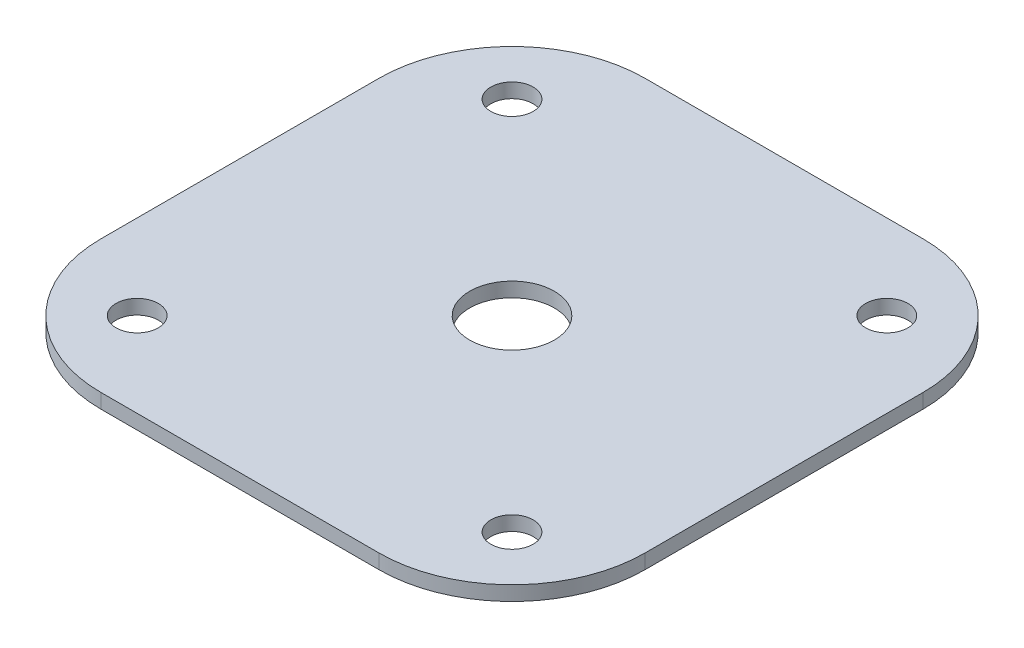
ISO-10303-21;
HEADER;
FILE_DESCRIPTION(('STEP AP214'),'2;1');
FILE_NAME('part.step','',(''),(''),'','','');
FILE_SCHEMA(('AUTOMOTIVE_DESIGN { 1 0 10303 214 1 1 1 1 }'));
ENDSEC;
DATA;
#1=APPLICATION_CONTEXT('core data for automotive mechanical design processes');
#2=APPLICATION_PROTOCOL_DEFINITION('international standard','automotive_design',2000,#1);
#3=PRODUCT_CONTEXT('',#1,'mechanical');
#4=PRODUCT('Part','Part','',(#3));
#5=PRODUCT_RELATED_PRODUCT_CATEGORY('part','',(#4));
#6=PRODUCT_DEFINITION_FORMATION('','',#4);
#7=PRODUCT_DEFINITION_CONTEXT('part definition',#1,'design');
#8=PRODUCT_DEFINITION('design','',#6,#7);
#9=PRODUCT_DEFINITION_SHAPE('','',#8);
#10=(LENGTH_UNIT() NAMED_UNIT(*) SI_UNIT(.MILLI.,.METRE.));
#11=(NAMED_UNIT(*) PLANE_ANGLE_UNIT() SI_UNIT($,.RADIAN.));
#12=(NAMED_UNIT(*) SI_UNIT($,.STERADIAN.) SOLID_ANGLE_UNIT());
#13=UNCERTAINTY_MEASURE_WITH_UNIT(LENGTH_MEASURE(1.E-05),#10,'distance_accuracy_value','');
#14=(GEOMETRIC_REPRESENTATION_CONTEXT(3) GLOBAL_UNCERTAINTY_ASSIGNED_CONTEXT((#13)) GLOBAL_UNIT_ASSIGNED_CONTEXT((#10,
#11,#12)) REPRESENTATION_CONTEXT('',''));
#15=CARTESIAN_POINT('',(0.,0.,0.));
#16=DIRECTION('',(0.,0.,1.));
#17=DIRECTION('',(1.,0.,0.));
#18=AXIS2_PLACEMENT_3D('',#15,#16,#17);
#19=CARTESIAN_POINT('',(-11.5,1.2,11.5));
#20=DIRECTION('',(0.,1.,0.));
#21=DIRECTION('',(0.,0.,1.));
#22=AXIS2_PLACEMENT_3D('',#19,#20,#21);
#23=PLANE('',#22);
#24=CARTESIAN_POINT('',(15.5,1.2,15.5));
#25=DIRECTION('',(0.,1.,0.));
#26=DIRECTION('',(0.,0.,-1.));
#27=AXIS2_PLACEMENT_3D('',#24,#25,#26);
#28=CIRCLE('',#27,1.75);
#29=CARTESIAN_POINT('',(15.5,1.2,13.75));
#30=VERTEX_POINT('',#29);
#31=EDGE_CURVE('E193',#30,#30,#28,.T.);
#32=ORIENTED_EDGE('',*,*,#31,.F.);
#33=EDGE_LOOP('',(#32));
#34=FACE_BOUND('',#33,.T.);
#35=CARTESIAN_POINT('',(-15.5,1.2,-15.5));
#36=DIRECTION('',(0.,1.,0.));
#37=DIRECTION('',(0.,0.,1.));
#38=AXIS2_PLACEMENT_3D('',#35,#36,#37);
#39=CIRCLE('',#38,1.75);
#40=CARTESIAN_POINT('',(-15.5,1.2,-13.75));
#41=VERTEX_POINT('',#40);
#42=EDGE_CURVE('E181',#41,#41,#39,.T.);
#43=ORIENTED_EDGE('',*,*,#42,.F.);
#44=EDGE_LOOP('',(#43));
#45=FACE_BOUND('',#44,.T.);
#46=CARTESIAN_POINT('',(-11.5,1.2,11.5));
#47=DIRECTION('',(0.,1.,0.));
#48=DIRECTION('',(0.,0.,1.));
#49=AXIS2_PLACEMENT_3D('',#46,#47,#48);
#50=CIRCLE('',#49,11.);
#51=CARTESIAN_POINT('',(-22.5,1.2,11.5));
#52=VERTEX_POINT('',#51);
#53=CARTESIAN_POINT('',(-11.5,1.2,22.5));
#54=VERTEX_POINT('',#53);
#55=EDGE_CURVE('E144',#52,#54,#50,.T.);
#56=ORIENTED_EDGE('',*,*,#55,.T.);
#57=DIRECTION('',(1.,0.,0.));
#58=VECTOR('',#57,1.);
#59=CARTESIAN_POINT('',(-11.5,1.2,22.5));
#60=LINE('',#59,#58);
#61=CARTESIAN_POINT('',(11.5,1.2,22.5));
#62=VERTEX_POINT('',#61);
#63=EDGE_CURVE('E92',#54,#62,#60,.T.);
#64=ORIENTED_EDGE('',*,*,#63,.T.);
#65=CARTESIAN_POINT('',(11.5,1.2,11.5));
#66=DIRECTION('',(0.,1.,0.));
#67=DIRECTION('',(0.,0.,1.));
#68=AXIS2_PLACEMENT_3D('',#65,#66,#67);
#69=CIRCLE('',#68,11.);
#70=CARTESIAN_POINT('',(22.5,1.2,11.5));
#71=VERTEX_POINT('',#70);
#72=EDGE_CURVE('E159',#62,#71,#69,.T.);
#73=ORIENTED_EDGE('',*,*,#72,.T.);
#74=DIRECTION('',(0.,0.,-1.));
#75=VECTOR('',#74,1.);
#76=CARTESIAN_POINT('',(22.5,1.2,-11.5));
#77=LINE('',#76,#75);
#78=CARTESIAN_POINT('',(22.5,1.2,-11.5));
#79=VERTEX_POINT('',#78);
#80=EDGE_CURVE('E172',#71,#79,#77,.T.);
#81=ORIENTED_EDGE('',*,*,#80,.T.);
#82=CARTESIAN_POINT('',(11.5,1.2,-11.5));
#83=DIRECTION('',(0.,1.,0.));
#84=DIRECTION('',(0.,0.,-1.));
#85=AXIS2_PLACEMENT_3D('',#82,#83,#84);
#86=CIRCLE('',#85,11.);
#87=CARTESIAN_POINT('',(11.5,1.2,-22.5));
#88=VERTEX_POINT('',#87);
#89=EDGE_CURVE('E111',#79,#88,#86,.T.);
#90=ORIENTED_EDGE('',*,*,#89,.T.);
#91=DIRECTION('',(-1.,0.,0.));
#92=VECTOR('',#91,1.);
#93=CARTESIAN_POINT('',(-11.5,1.2,-22.5));
#94=LINE('',#93,#92);
#95=CARTESIAN_POINT('',(-11.5,1.2,-22.5));
#96=VERTEX_POINT('',#95);
#97=EDGE_CURVE('E105',#88,#96,#94,.T.);
#98=ORIENTED_EDGE('',*,*,#97,.T.);
#99=CARTESIAN_POINT('',(-11.5,1.2,-11.5));
#100=DIRECTION('',(0.,1.,0.));
#101=DIRECTION('',(0.,0.,1.));
#102=AXIS2_PLACEMENT_3D('',#99,#100,#101);
#103=CIRCLE('',#102,11.);
#104=CARTESIAN_POINT('',(-22.5,1.2,-11.5));
#105=VERTEX_POINT('',#104);
#106=EDGE_CURVE('E109',#96,#105,#103,.T.);
#107=ORIENTED_EDGE('',*,*,#106,.T.);
#108=DIRECTION('',(0.,0.,1.));
#109=VECTOR('',#108,1.);
#110=CARTESIAN_POINT('',(-22.5,1.2,-11.5));
#111=LINE('',#110,#109);
#112=EDGE_CURVE('E49',#105,#52,#111,.T.);
#113=ORIENTED_EDGE('',*,*,#112,.T.);
#114=EDGE_LOOP('',(#56,#64,#73,#81,#90,#98,#107,#113));
#115=FACE_BOUND('',#114,.T.);
#116=CARTESIAN_POINT('',(0.,1.2,0.));
#117=DIRECTION('',(0.,1.,0.));
#118=DIRECTION('',(0.,0.,1.));
#119=AXIS2_PLACEMENT_3D('',#116,#117,#118);
#120=CIRCLE('',#119,3.5);
#121=CARTESIAN_POINT('',(0.,1.2,3.5));
#122=VERTEX_POINT('',#121);
#123=EDGE_CURVE('E133',#122,#122,#120,.T.);
#124=ORIENTED_EDGE('',*,*,#123,.F.);
#125=EDGE_LOOP('',(#124));
#126=FACE_BOUND('',#125,.T.);
#127=CARTESIAN_POINT('',(15.5,1.2,-15.5));
#128=DIRECTION('',(0.,1.,0.));
#129=DIRECTION('',(0.,0.,1.));
#130=AXIS2_PLACEMENT_3D('',#127,#128,#129);
#131=CIRCLE('',#130,1.75);
#132=CARTESIAN_POINT('',(15.5,1.2,-13.75));
#133=VERTEX_POINT('',#132);
#134=EDGE_CURVE('E187',#133,#133,#131,.T.);
#135=ORIENTED_EDGE('',*,*,#134,.F.);
#136=EDGE_LOOP('',(#135));
#137=FACE_BOUND('',#136,.T.);
#138=CARTESIAN_POINT('',(-15.5,1.2,15.5));
#139=DIRECTION('',(0.,1.,0.));
#140=DIRECTION('',(0.,0.,-1.));
#141=AXIS2_PLACEMENT_3D('',#138,#139,#140);
#142=CIRCLE('',#141,1.75);
#143=CARTESIAN_POINT('',(-15.5,1.2,13.75));
#144=VERTEX_POINT('',#143);
#145=EDGE_CURVE('E199',#144,#144,#142,.T.);
#146=ORIENTED_EDGE('',*,*,#145,.F.);
#147=EDGE_LOOP('',(#146));
#148=FACE_BOUND('',#147,.T.);
#149=ADVANCED_FACE('F32',(#34,#45,#115,#126,#137,#148),#23,.T.);
#150=CARTESIAN_POINT('',(-11.5,0.,11.5));
#151=DIRECTION('',(0.,1.,0.));
#152=DIRECTION('',(0.,0.,1.));
#153=AXIS2_PLACEMENT_3D('',#150,#151,#152);
#154=PLANE('',#153);
#155=CARTESIAN_POINT('',(-11.5,0.,11.5));
#156=DIRECTION('',(0.,1.,0.));
#157=DIRECTION('',(0.,0.,1.));
#158=AXIS2_PLACEMENT_3D('',#155,#156,#157);
#159=CIRCLE('',#158,11.);
#160=CARTESIAN_POINT('',(-22.5,0.,11.5));
#161=VERTEX_POINT('',#160);
#162=CARTESIAN_POINT('',(-11.5,0.,22.5));
#163=VERTEX_POINT('',#162);
#164=EDGE_CURVE('E129',#161,#163,#159,.T.);
#165=ORIENTED_EDGE('',*,*,#164,.F.);
#166=DIRECTION('',(0.,0.,1.));
#167=VECTOR('',#166,1.);
#168=CARTESIAN_POINT('',(-22.5,0.,-11.5));
#169=LINE('',#168,#167);
#170=CARTESIAN_POINT('',(-22.5,0.,-11.5));
#171=VERTEX_POINT('',#170);
#172=EDGE_CURVE('E84',#171,#161,#169,.T.);
#173=ORIENTED_EDGE('',*,*,#172,.F.);
#174=CARTESIAN_POINT('',(-11.5,0.,-11.5));
#175=DIRECTION('',(0.,1.,0.));
#176=DIRECTION('',(0.,0.,1.));
#177=AXIS2_PLACEMENT_3D('',#174,#175,#176);
#178=CIRCLE('',#177,11.);
#179=CARTESIAN_POINT('',(-11.5,0.,-22.5));
#180=VERTEX_POINT('',#179);
#181=EDGE_CURVE('E78',#180,#171,#178,.T.);
#182=ORIENTED_EDGE('',*,*,#181,.F.);
#183=DIRECTION('',(-1.,0.,0.));
#184=VECTOR('',#183,1.);
#185=CARTESIAN_POINT('',(-11.5,0.,-22.5));
#186=LINE('',#185,#184);
#187=CARTESIAN_POINT('',(11.5,0.,-22.5));
#188=VERTEX_POINT('',#187);
#189=EDGE_CURVE('E119',#188,#180,#186,.T.);
#190=ORIENTED_EDGE('',*,*,#189,.F.);
#191=CARTESIAN_POINT('',(11.5,0.,-11.5));
#192=DIRECTION('',(0.,1.,0.));
#193=DIRECTION('',(0.,0.,-1.));
#194=AXIS2_PLACEMENT_3D('',#191,#192,#193);
#195=CIRCLE('',#194,11.);
#196=CARTESIAN_POINT('',(22.5,0.,-11.5));
#197=VERTEX_POINT('',#196);
#198=EDGE_CURVE('E139',#197,#188,#195,.T.);
#199=ORIENTED_EDGE('',*,*,#198,.F.);
#200=DIRECTION('',(0.,0.,-1.));
#201=VECTOR('',#200,1.);
#202=CARTESIAN_POINT('',(22.5,0.,-11.5));
#203=LINE('',#202,#201);
#204=CARTESIAN_POINT('',(22.5,0.,11.5));
#205=VERTEX_POINT('',#204);
#206=EDGE_CURVE('E137',#205,#197,#203,.T.);
#207=ORIENTED_EDGE('',*,*,#206,.F.);
#208=CARTESIAN_POINT('',(11.5,0.,11.5));
#209=DIRECTION('',(0.,1.,0.));
#210=DIRECTION('',(0.,0.,1.));
#211=AXIS2_PLACEMENT_3D('',#208,#209,#210);
#212=CIRCLE('',#211,11.);
#213=CARTESIAN_POINT('',(11.5,0.,22.5));
#214=VERTEX_POINT('',#213);
#215=EDGE_CURVE('E135',#214,#205,#212,.T.);
#216=ORIENTED_EDGE('',*,*,#215,.F.);
#217=DIRECTION('',(1.,0.,0.));
#218=VECTOR('',#217,1.);
#219=CARTESIAN_POINT('',(-11.5,0.,22.5));
#220=LINE('',#219,#218);
#221=EDGE_CURVE('E132',#163,#214,#220,.T.);
#222=ORIENTED_EDGE('',*,*,#221,.F.);
#223=EDGE_LOOP('',(#165,#173,#182,#190,#199,#207,#216,#222));
#224=FACE_BOUND('',#223,.T.);
#225=CARTESIAN_POINT('',(0.,0.,0.));
#226=DIRECTION('',(0.,1.,0.));
#227=DIRECTION('',(0.,0.,1.));
#228=AXIS2_PLACEMENT_3D('',#225,#226,#227);
#229=CIRCLE('',#228,3.5);
#230=CARTESIAN_POINT('',(0.,0.,3.5));
#231=VERTEX_POINT('',#230);
#232=EDGE_CURVE('E178',#231,#231,#229,.T.);
#233=ORIENTED_EDGE('',*,*,#232,.T.);
#234=EDGE_LOOP('',(#233));
#235=FACE_BOUND('',#234,.T.);
#236=CARTESIAN_POINT('',(-15.5,0.,-15.5));
#237=DIRECTION('',(0.,1.,0.));
#238=DIRECTION('',(0.,0.,1.));
#239=AXIS2_PLACEMENT_3D('',#236,#237,#238);
#240=CIRCLE('',#239,1.75);
#241=CARTESIAN_POINT('',(-15.5,0.,-13.75));
#242=VERTEX_POINT('',#241);
#243=EDGE_CURVE('E184',#242,#242,#240,.T.);
#244=ORIENTED_EDGE('',*,*,#243,.T.);
#245=EDGE_LOOP('',(#244));
#246=FACE_BOUND('',#245,.T.);
#247=CARTESIAN_POINT('',(15.5,0.,-15.5));
#248=DIRECTION('',(0.,1.,0.));
#249=DIRECTION('',(0.,0.,1.));
#250=AXIS2_PLACEMENT_3D('',#247,#248,#249);
#251=CIRCLE('',#250,1.75);
#252=CARTESIAN_POINT('',(15.5,0.,-13.75));
#253=VERTEX_POINT('',#252);
#254=EDGE_CURVE('E190',#253,#253,#251,.T.);
#255=ORIENTED_EDGE('',*,*,#254,.T.);
#256=EDGE_LOOP('',(#255));
#257=FACE_BOUND('',#256,.T.);
#258=CARTESIAN_POINT('',(15.5,0.,15.5));
#259=DIRECTION('',(0.,1.,0.));
#260=DIRECTION('',(0.,0.,-1.));
#261=AXIS2_PLACEMENT_3D('',#258,#259,#260);
#262=CIRCLE('',#261,1.75);
#263=CARTESIAN_POINT('',(15.5,0.,13.75));
#264=VERTEX_POINT('',#263);
#265=EDGE_CURVE('E196',#264,#264,#262,.T.);
#266=ORIENTED_EDGE('',*,*,#265,.T.);
#267=EDGE_LOOP('',(#266));
#268=FACE_BOUND('',#267,.T.);
#269=CARTESIAN_POINT('',(-15.5,0.,15.5));
#270=DIRECTION('',(0.,1.,0.));
#271=DIRECTION('',(0.,0.,-1.));
#272=AXIS2_PLACEMENT_3D('',#269,#270,#271);
#273=CIRCLE('',#272,1.75);
#274=CARTESIAN_POINT('',(-15.5,0.,13.75));
#275=VERTEX_POINT('',#274);
#276=EDGE_CURVE('E202',#275,#275,#273,.T.);
#277=ORIENTED_EDGE('',*,*,#276,.T.);
#278=EDGE_LOOP('',(#277));
#279=FACE_BOUND('',#278,.T.);
#280=ADVANCED_FACE('F163',(#224,#235,#246,#257,#268,#279),#154,.F.);
#281=CARTESIAN_POINT('',(-11.5,1.2,11.5));
#282=DIRECTION('',(0.,-1.,0.));
#283=DIRECTION('',(0.,0.,-1.));
#284=AXIS2_PLACEMENT_3D('',#281,#282,#283);
#285=CYLINDRICAL_SURFACE('',#284,11.);
#286=ORIENTED_EDGE('',*,*,#164,.T.);
#287=DIRECTION('',(0.,-1.,0.));
#288=VECTOR('',#287,1.);
#289=CARTESIAN_POINT('',(-11.5,1.2,22.5));
#290=LINE('',#289,#288);
#291=EDGE_CURVE('E11',#54,#163,#290,.T.);
#292=ORIENTED_EDGE('',*,*,#291,.F.);
#293=ORIENTED_EDGE('',*,*,#55,.F.);
#294=DIRECTION('',(0.,-1.,0.));
#295=VECTOR('',#294,1.);
#296=CARTESIAN_POINT('',(-22.5,1.2,11.5));
#297=LINE('',#296,#295);
#298=EDGE_CURVE('E125',#52,#161,#297,.T.);
#299=ORIENTED_EDGE('',*,*,#298,.T.);
#300=EDGE_LOOP('',(#286,#292,#293,#299));
#301=FACE_BOUND('',#300,.T.);
#302=ADVANCED_FACE('F34',(#301),#285,.T.);
#303=CARTESIAN_POINT('',(-11.5,1.2,22.5));
#304=DIRECTION('',(0.,0.,-1.));
#305=DIRECTION('',(-1.,0.,0.));
#306=AXIS2_PLACEMENT_3D('',#303,#304,#305);
#307=PLANE('',#306);
#308=ORIENTED_EDGE('',*,*,#221,.T.);
#309=DIRECTION('',(0.,-1.,0.));
#310=VECTOR('',#309,1.);
#311=CARTESIAN_POINT('',(11.5,1.2,22.5));
#312=LINE('',#311,#310);
#313=EDGE_CURVE('E41',#62,#214,#312,.T.);
#314=ORIENTED_EDGE('',*,*,#313,.F.);
#315=ORIENTED_EDGE('',*,*,#63,.F.);
#316=ORIENTED_EDGE('',*,*,#291,.T.);
#317=EDGE_LOOP('',(#308,#314,#315,#316));
#318=FACE_BOUND('',#317,.T.);
#319=ADVANCED_FACE('F236',(#318),#307,.F.);
#320=CARTESIAN_POINT('',(11.5,1.2,11.5));
#321=DIRECTION('',(0.,-1.,0.));
#322=DIRECTION('',(0.,0.,-1.));
#323=AXIS2_PLACEMENT_3D('',#320,#321,#322);
#324=CYLINDRICAL_SURFACE('',#323,11.);
#325=ORIENTED_EDGE('',*,*,#215,.T.);
#326=DIRECTION('',(0.,-1.,0.));
#327=VECTOR('',#326,1.);
#328=CARTESIAN_POINT('',(22.5,1.2,11.5));
#329=LINE('',#328,#327);
#330=EDGE_CURVE('E151',#71,#205,#329,.T.);
#331=ORIENTED_EDGE('',*,*,#330,.F.);
#332=ORIENTED_EDGE('',*,*,#72,.F.);
#333=ORIENTED_EDGE('',*,*,#313,.T.);
#334=EDGE_LOOP('',(#325,#331,#332,#333));
#335=FACE_BOUND('',#334,.T.);
#336=ADVANCED_FACE('F157',(#335),#324,.T.);
#337=CARTESIAN_POINT('',(22.5,1.2,-11.5));
#338=DIRECTION('',(-1.,0.,0.));
#339=DIRECTION('',(0.,0.,1.));
#340=AXIS2_PLACEMENT_3D('',#337,#338,#339);
#341=PLANE('',#340);
#342=ORIENTED_EDGE('',*,*,#206,.T.);
#343=DIRECTION('',(0.,-1.,0.));
#344=VECTOR('',#343,1.);
#345=CARTESIAN_POINT('',(22.5,1.2,-11.5));
#346=LINE('',#345,#344);
#347=EDGE_CURVE('E148',#79,#197,#346,.T.);
#348=ORIENTED_EDGE('',*,*,#347,.F.);
#349=ORIENTED_EDGE('',*,*,#80,.F.);
#350=ORIENTED_EDGE('',*,*,#330,.T.);
#351=EDGE_LOOP('',(#342,#348,#349,#350));
#352=FACE_BOUND('',#351,.T.);
#353=ADVANCED_FACE('F168',(#352),#341,.F.);
#354=CARTESIAN_POINT('',(11.5,1.2,-11.5));
#355=DIRECTION('',(0.,-1.,0.));
#356=DIRECTION('',(0.,0.,-1.));
#357=AXIS2_PLACEMENT_3D('',#354,#355,#356);
#358=CYLINDRICAL_SURFACE('',#357,11.);
#359=ORIENTED_EDGE('',*,*,#198,.T.);
#360=DIRECTION('',(0.,-1.,0.));
#361=VECTOR('',#360,1.);
#362=CARTESIAN_POINT('',(11.5,1.2,-22.5));
#363=LINE('',#362,#361);
#364=EDGE_CURVE('E120',#88,#188,#363,.T.);
#365=ORIENTED_EDGE('',*,*,#364,.F.);
#366=ORIENTED_EDGE('',*,*,#89,.F.);
#367=ORIENTED_EDGE('',*,*,#347,.T.);
#368=EDGE_LOOP('',(#359,#365,#366,#367));
#369=FACE_BOUND('',#368,.T.);
#370=ADVANCED_FACE('F171',(#369),#358,.T.);
#371=CARTESIAN_POINT('',(-11.5,1.2,-22.5));
#372=DIRECTION('',(0.,0.,1.));
#373=DIRECTION('',(1.,0.,0.));
#374=AXIS2_PLACEMENT_3D('',#371,#372,#373);
#375=PLANE('',#374);
#376=ORIENTED_EDGE('',*,*,#189,.T.);
#377=DIRECTION('',(0.,-1.,0.));
#378=VECTOR('',#377,1.);
#379=CARTESIAN_POINT('',(-11.5,1.2,-22.5));
#380=LINE('',#379,#378);
#381=EDGE_CURVE('E116',#96,#180,#380,.T.);
#382=ORIENTED_EDGE('',*,*,#381,.F.);
#383=ORIENTED_EDGE('',*,*,#97,.F.);
#384=ORIENTED_EDGE('',*,*,#364,.T.);
#385=EDGE_LOOP('',(#376,#382,#383,#384));
#386=FACE_BOUND('',#385,.T.);
#387=ADVANCED_FACE('F117',(#386),#375,.F.);
#388=CARTESIAN_POINT('',(-11.5,1.2,-11.5));
#389=DIRECTION('',(0.,-1.,0.));
#390=DIRECTION('',(0.,0.,-1.));
#391=AXIS2_PLACEMENT_3D('',#388,#389,#390);
#392=CYLINDRICAL_SURFACE('',#391,11.);
#393=ORIENTED_EDGE('',*,*,#181,.T.);
#394=DIRECTION('',(0.,-1.,0.));
#395=VECTOR('',#394,1.);
#396=CARTESIAN_POINT('',(-22.5,1.2,-11.5));
#397=LINE('',#396,#395);
#398=EDGE_CURVE('E121',#105,#171,#397,.T.);
#399=ORIENTED_EDGE('',*,*,#398,.F.);
#400=ORIENTED_EDGE('',*,*,#106,.F.);
#401=ORIENTED_EDGE('',*,*,#381,.T.);
#402=EDGE_LOOP('',(#393,#399,#400,#401));
#403=FACE_BOUND('',#402,.T.);
#404=ADVANCED_FACE('F123',(#403),#392,.T.);
#405=CARTESIAN_POINT('',(-22.5,1.2,-11.5));
#406=DIRECTION('',(1.,0.,0.));
#407=DIRECTION('',(0.,0.,-1.));
#408=AXIS2_PLACEMENT_3D('',#405,#406,#407);
#409=PLANE('',#408);
#410=ORIENTED_EDGE('',*,*,#172,.T.);
#411=ORIENTED_EDGE('',*,*,#298,.F.);
#412=ORIENTED_EDGE('',*,*,#112,.F.);
#413=ORIENTED_EDGE('',*,*,#398,.T.);
#414=EDGE_LOOP('',(#410,#411,#412,#413));
#415=FACE_BOUND('',#414,.T.);
#416=ADVANCED_FACE('F224',(#415),#409,.F.);
#417=CARTESIAN_POINT('',(0.,1.2,0.));
#418=DIRECTION('',(0.,-1.,0.));
#419=DIRECTION('',(0.,0.,-1.));
#420=AXIS2_PLACEMENT_3D('',#417,#418,#419);
#421=CYLINDRICAL_SURFACE('',#420,3.5);
#422=ORIENTED_EDGE('',*,*,#123,.T.);
#423=EDGE_LOOP('',(#422));
#424=FACE_BOUND('',#423,.T.);
#425=ORIENTED_EDGE('',*,*,#232,.F.);
#426=EDGE_LOOP('',(#425));
#427=FACE_BOUND('',#426,.T.);
#428=ADVANCED_FACE('F221',(#424,#427),#421,.F.);
#429=CARTESIAN_POINT('',(-15.5,1.2,-15.5));
#430=DIRECTION('',(0.,-1.,0.));
#431=DIRECTION('',(0.,0.,-1.));
#432=AXIS2_PLACEMENT_3D('',#429,#430,#431);
#433=CYLINDRICAL_SURFACE('',#432,1.75);
#434=ORIENTED_EDGE('',*,*,#42,.T.);
#435=EDGE_LOOP('',(#434));
#436=FACE_BOUND('',#435,.T.);
#437=ORIENTED_EDGE('',*,*,#243,.F.);
#438=EDGE_LOOP('',(#437));
#439=FACE_BOUND('',#438,.T.);
#440=ADVANCED_FACE('F300',(#436,#439),#433,.F.);
#441=CARTESIAN_POINT('',(15.5,1.2,-15.5));
#442=DIRECTION('',(0.,-1.,0.));
#443=DIRECTION('',(0.,0.,-1.));
#444=AXIS2_PLACEMENT_3D('',#441,#442,#443);
#445=CYLINDRICAL_SURFACE('',#444,1.75);
#446=ORIENTED_EDGE('',*,*,#134,.T.);
#447=EDGE_LOOP('',(#446));
#448=FACE_BOUND('',#447,.T.);
#449=ORIENTED_EDGE('',*,*,#254,.F.);
#450=EDGE_LOOP('',(#449));
#451=FACE_BOUND('',#450,.T.);
#452=ADVANCED_FACE('F308',(#448,#451),#445,.F.);
#453=CARTESIAN_POINT('',(15.5,1.2,15.5));
#454=DIRECTION('',(0.,-1.,0.));
#455=DIRECTION('',(0.,0.,-1.));
#456=AXIS2_PLACEMENT_3D('',#453,#454,#455);
#457=CYLINDRICAL_SURFACE('',#456,1.75);
#458=ORIENTED_EDGE('',*,*,#31,.T.);
#459=EDGE_LOOP('',(#458));
#460=FACE_BOUND('',#459,.T.);
#461=ORIENTED_EDGE('',*,*,#265,.F.);
#462=EDGE_LOOP('',(#461));
#463=FACE_BOUND('',#462,.T.);
#464=ADVANCED_FACE('F316',(#460,#463),#457,.F.);
#465=CARTESIAN_POINT('',(-15.5,1.2,15.5));
#466=DIRECTION('',(0.,-1.,0.));
#467=DIRECTION('',(0.,0.,-1.));
#468=AXIS2_PLACEMENT_3D('',#465,#466,#467);
#469=CYLINDRICAL_SURFACE('',#468,1.75);
#470=ORIENTED_EDGE('',*,*,#145,.T.);
#471=EDGE_LOOP('',(#470));
#472=FACE_BOUND('',#471,.T.);
#473=ORIENTED_EDGE('',*,*,#276,.F.);
#474=EDGE_LOOP('',(#473));
#475=FACE_BOUND('',#474,.T.);
#476=ADVANCED_FACE('F208',(#472,#475),#469,.F.);
#477=CLOSED_SHELL('',(#149,#280,#302,#319,#336,#353,#370,#387,#404,#416,#428,#440,#452,#464,#476));
#478=MANIFOLD_SOLID_BREP('B2',#477);
#479=ADVANCED_BREP_SHAPE_REPRESENTATION('',(#18,#478),#14);
#480=SHAPE_DEFINITION_REPRESENTATION(#9,#479);
ENDSEC;
END-ISO-10303-21;
